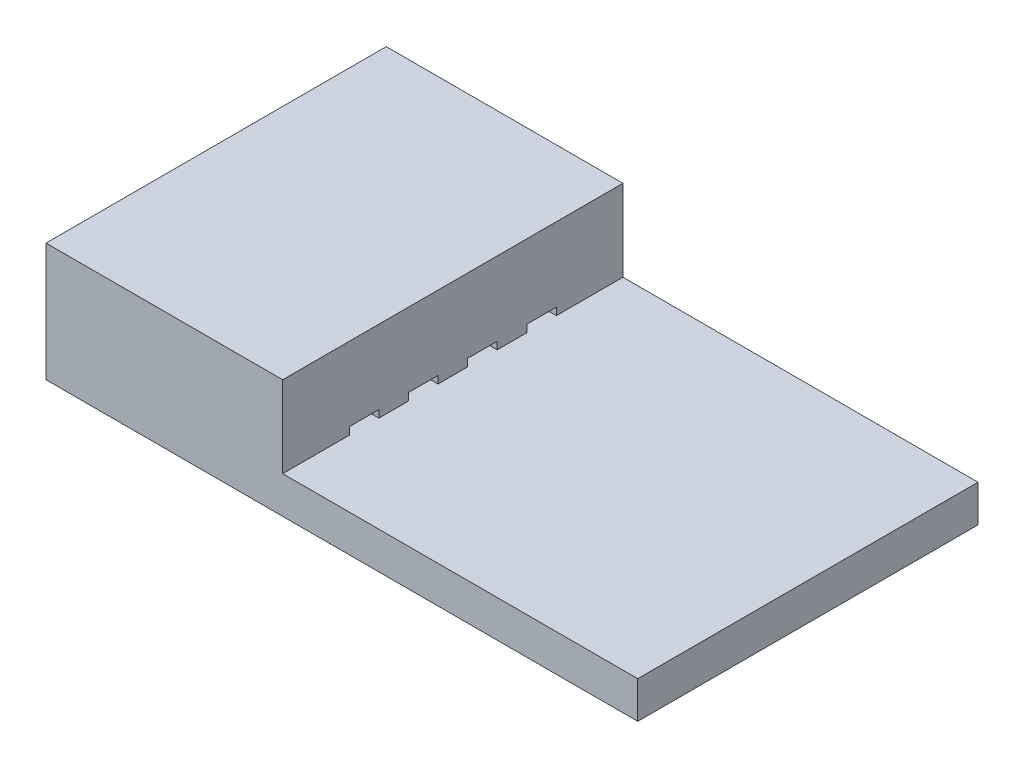
ISO-10303-21;
HEADER;
FILE_DESCRIPTION(('STEP AP214'),'2;1');
FILE_NAME('part.step','',(''),(''),'','','');
FILE_SCHEMA(('AUTOMOTIVE_DESIGN { 1 0 10303 214 1 1 1 1 }'));
ENDSEC;
DATA;
#1=APPLICATION_CONTEXT('core data for automotive mechanical design processes');
#2=APPLICATION_PROTOCOL_DEFINITION('international standard','automotive_design',2000,#1);
#3=PRODUCT_CONTEXT('',#1,'mechanical');
#4=PRODUCT('Part','Part','',(#3));
#5=PRODUCT_RELATED_PRODUCT_CATEGORY('part','',(#4));
#6=PRODUCT_DEFINITION_FORMATION('','',#4);
#7=PRODUCT_DEFINITION_CONTEXT('part definition',#1,'design');
#8=PRODUCT_DEFINITION('design','',#6,#7);
#9=PRODUCT_DEFINITION_SHAPE('','',#8);
#10=(LENGTH_UNIT() NAMED_UNIT(*) SI_UNIT(.MILLI.,.METRE.));
#11=(NAMED_UNIT(*) PLANE_ANGLE_UNIT() SI_UNIT($,.RADIAN.));
#12=(NAMED_UNIT(*) SI_UNIT($,.STERADIAN.) SOLID_ANGLE_UNIT());
#13=UNCERTAINTY_MEASURE_WITH_UNIT(LENGTH_MEASURE(1.E-05),#10,'distance_accuracy_value','');
#14=(GEOMETRIC_REPRESENTATION_CONTEXT(3) GLOBAL_UNCERTAINTY_ASSIGNED_CONTEXT((#13)) GLOBAL_UNIT_ASSIGNED_CONTEXT((#10,
#11,#12)) REPRESENTATION_CONTEXT('',''));
#15=CARTESIAN_POINT('',(0.,0.,0.));
#16=DIRECTION('',(0.,0.,1.));
#17=DIRECTION('',(1.,0.,0.));
#18=AXIS2_PLACEMENT_3D('',#15,#16,#17);
#19=CARTESIAN_POINT('',(-20.,2.,-5.75));
#20=DIRECTION('',(0.,0.,-1.));
#21=DIRECTION('',(-1.,0.,0.));
#22=AXIS2_PLACEMENT_3D('',#19,#20,#21);
#23=PLANE('',#22);
#24=DIRECTION('',(-1.,0.,0.));
#25=VECTOR('',#24,1.);
#26=CARTESIAN_POINT('',(0.,-0.750000000000001,-5.75));
#27=LINE('',#26,#25);
#28=CARTESIAN_POINT('',(0.,-0.750000000000001,-5.75));
#29=VERTEX_POINT('',#28);
#30=CARTESIAN_POINT('',(-12.,-0.750000000000001,-5.75));
#31=VERTEX_POINT('',#30);
#32=EDGE_CURVE('E316',#29,#31,#27,.T.);
#33=ORIENTED_EDGE('',*,*,#32,.F.);
#34=DIRECTION('',(0.,1.,0.));
#35=VECTOR('',#34,1.);
#36=CARTESIAN_POINT('',(0.,2.,-5.75));
#37=LINE('',#36,#35);
#38=CARTESIAN_POINT('',(0.,-2.,-5.75));
#39=VERTEX_POINT('',#38);
#40=EDGE_CURVE('E322',#39,#29,#37,.T.);
#41=ORIENTED_EDGE('',*,*,#40,.F.);
#42=DIRECTION('',(1.,0.,0.));
#43=VECTOR('',#42,1.);
#44=CARTESIAN_POINT('',(-20.,-2.,-5.75));
#45=LINE('',#44,#43);
#46=CARTESIAN_POINT('',(-20.,-2.,-5.75));
#47=VERTEX_POINT('',#46);
#48=EDGE_CURVE('E12',#47,#39,#45,.T.);
#49=ORIENTED_EDGE('',*,*,#48,.F.);
#50=DIRECTION('',(0.,1.,0.));
#51=VECTOR('',#50,1.);
#52=CARTESIAN_POINT('',(-20.,2.,-5.75));
#53=LINE('',#52,#51);
#54=CARTESIAN_POINT('',(-20.,2.,-5.75));
#55=VERTEX_POINT('',#54);
#56=EDGE_CURVE('E333',#47,#55,#53,.T.);
#57=ORIENTED_EDGE('',*,*,#56,.T.);
#58=DIRECTION('',(1.,0.,0.));
#59=VECTOR('',#58,1.);
#60=CARTESIAN_POINT('',(-20.,2.,-5.75));
#61=LINE('',#60,#59);
#62=CARTESIAN_POINT('',(-12.,2.,-5.75));
#63=VERTEX_POINT('',#62);
#64=EDGE_CURVE('E44',#55,#63,#61,.T.);
#65=ORIENTED_EDGE('',*,*,#64,.T.);
#66=DIRECTION('',(0.,1.,0.));
#67=VECTOR('',#66,1.);
#68=CARTESIAN_POINT('',(-12.,-18.6207701385947,-5.75));
#69=LINE('',#68,#67);
#70=EDGE_CURVE('E319',#31,#63,#69,.T.);
#71=ORIENTED_EDGE('',*,*,#70,.F.);
#72=EDGE_LOOP('',(#33,#41,#49,#57,#65,#71));
#73=FACE_BOUND('',#72,.T.);
#74=ADVANCED_FACE('F41',(#73),#23,.T.);
#75=CARTESIAN_POINT('',(-20.,-2.,5.75));
#76=DIRECTION('',(0.,-1.,0.));
#77=DIRECTION('',(0.,0.,-1.));
#78=AXIS2_PLACEMENT_3D('',#75,#76,#77);
#79=PLANE('',#78);
#80=DIRECTION('',(0.,0.,-1.));
#81=VECTOR('',#80,1.);
#82=CARTESIAN_POINT('',(0.,-2.,5.75));
#83=LINE('',#82,#81);
#84=CARTESIAN_POINT('',(0.,-2.,5.75));
#85=VERTEX_POINT('',#84);
#86=EDGE_CURVE('E337',#85,#39,#83,.T.);
#87=ORIENTED_EDGE('',*,*,#86,.F.);
#88=DIRECTION('',(1.,0.,0.));
#89=VECTOR('',#88,1.);
#90=CARTESIAN_POINT('',(-20.,-2.,5.75));
#91=LINE('',#90,#89);
#92=CARTESIAN_POINT('',(-20.,-2.,5.75));
#93=VERTEX_POINT('',#92);
#94=EDGE_CURVE('E49',#93,#85,#91,.T.);
#95=ORIENTED_EDGE('',*,*,#94,.F.);
#96=DIRECTION('',(0.,0.,-1.));
#97=VECTOR('',#96,1.);
#98=CARTESIAN_POINT('',(-20.,-2.,5.75));
#99=LINE('',#98,#97);
#100=EDGE_CURVE('E343',#93,#47,#99,.T.);
#101=ORIENTED_EDGE('',*,*,#100,.T.);
#102=ORIENTED_EDGE('',*,*,#48,.T.);
#103=EDGE_LOOP('',(#87,#95,#101,#102));
#104=FACE_BOUND('',#103,.T.);
#105=ADVANCED_FACE('F384',(#104),#79,.T.);
#106=CARTESIAN_POINT('',(-20.,2.,5.75));
#107=DIRECTION('',(0.,0.,1.));
#108=DIRECTION('',(1.,0.,0.));
#109=AXIS2_PLACEMENT_3D('',#106,#107,#108);
#110=PLANE('',#109);
#111=DIRECTION('',(1.,0.,0.));
#112=VECTOR('',#111,1.);
#113=CARTESIAN_POINT('',(0.,-0.750000000000001,5.75));
#114=LINE('',#113,#112);
#115=CARTESIAN_POINT('',(-12.,-0.750000000000001,5.75));
#116=VERTEX_POINT('',#115);
#117=CARTESIAN_POINT('',(0.,-0.750000000000001,5.75));
#118=VERTEX_POINT('',#117);
#119=EDGE_CURVE('E323',#116,#118,#114,.T.);
#120=ORIENTED_EDGE('',*,*,#119,.F.);
#121=DIRECTION('',(0.,1.,0.));
#122=VECTOR('',#121,1.);
#123=CARTESIAN_POINT('',(-12.,-18.6207701385947,5.75));
#124=LINE('',#123,#122);
#125=CARTESIAN_POINT('',(-12.,2.,5.75));
#126=VERTEX_POINT('',#125);
#127=EDGE_CURVE('E325',#116,#126,#124,.T.);
#128=ORIENTED_EDGE('',*,*,#127,.T.);
#129=DIRECTION('',(1.,0.,0.));
#130=VECTOR('',#129,1.);
#131=CARTESIAN_POINT('',(-20.,2.,5.75));
#132=LINE('',#131,#130);
#133=CARTESIAN_POINT('',(-20.,2.,5.75));
#134=VERTEX_POINT('',#133);
#135=EDGE_CURVE('E353',#134,#126,#132,.T.);
#136=ORIENTED_EDGE('',*,*,#135,.F.);
#137=DIRECTION('',(0.,-1.,0.));
#138=VECTOR('',#137,1.);
#139=CARTESIAN_POINT('',(-20.,2.,5.75));
#140=LINE('',#139,#138);
#141=EDGE_CURVE('E340',#134,#93,#140,.T.);
#142=ORIENTED_EDGE('',*,*,#141,.T.);
#143=ORIENTED_EDGE('',*,*,#94,.T.);
#144=DIRECTION('',(0.,-1.,0.));
#145=VECTOR('',#144,1.);
#146=CARTESIAN_POINT('',(0.,2.,5.75));
#147=LINE('',#146,#145);
#148=EDGE_CURVE('E348',#118,#85,#147,.T.);
#149=ORIENTED_EDGE('',*,*,#148,.F.);
#150=EDGE_LOOP('',(#120,#128,#136,#142,#143,#149));
#151=FACE_BOUND('',#150,.T.);
#152=ADVANCED_FACE('F369',(#151),#110,.T.);
#153=CARTESIAN_POINT('',(-20.,2.,5.75));
#154=DIRECTION('',(0.,1.,0.));
#155=DIRECTION('',(0.,0.,1.));
#156=AXIS2_PLACEMENT_3D('',#153,#154,#155);
#157=PLANE('',#156);
#158=DIRECTION('',(0.,0.,1.));
#159=VECTOR('',#158,1.);
#160=CARTESIAN_POINT('',(-12.,2.,5.75));
#161=LINE('',#160,#159);
#162=EDGE_CURVE('E307',#63,#126,#161,.T.);
#163=ORIENTED_EDGE('',*,*,#162,.F.);
#164=ORIENTED_EDGE('',*,*,#64,.F.);
#165=DIRECTION('',(0.,0.,1.));
#166=VECTOR('',#165,1.);
#167=CARTESIAN_POINT('',(-20.,2.,5.75));
#168=LINE('',#167,#166);
#169=EDGE_CURVE('E336',#55,#134,#168,.T.);
#170=ORIENTED_EDGE('',*,*,#169,.T.);
#171=ORIENTED_EDGE('',*,*,#135,.T.);
#172=EDGE_LOOP('',(#163,#164,#170,#171));
#173=FACE_BOUND('',#172,.T.);
#174=ADVANCED_FACE('F363',(#173),#157,.T.);
#175=CARTESIAN_POINT('',(-20.,-2.,-5.75));
#176=DIRECTION('',(1.,0.,0.));
#177=DIRECTION('',(0.,0.,-1.));
#178=AXIS2_PLACEMENT_3D('',#175,#176,#177);
#179=PLANE('',#178);
#180=DIRECTION('',(0.,0.,1.));
#181=VECTOR('',#180,1.);
#182=CARTESIAN_POINT('',(-20.,-0.500000000000001,-2.5));
#183=LINE('',#182,#181);
#184=CARTESIAN_POINT('',(-20.,-0.500000000000001,-3.5));
#185=VERTEX_POINT('',#184);
#186=CARTESIAN_POINT('',(-20.,-0.500000000000001,-2.5));
#187=VERTEX_POINT('',#186);
#188=EDGE_CURVE('E197',#185,#187,#183,.T.);
#189=ORIENTED_EDGE('',*,*,#188,.T.);
#190=DIRECTION('',(0.,-1.,0.));
#191=VECTOR('',#190,1.);
#192=CARTESIAN_POINT('',(-20.,-0.750000000000001,-2.5));
#193=LINE('',#192,#191);
#194=CARTESIAN_POINT('',(-20.,-0.750000000000001,-2.5));
#195=VERTEX_POINT('',#194);
#196=EDGE_CURVE('E192',#187,#195,#193,.T.);
#197=ORIENTED_EDGE('',*,*,#196,.T.);
#198=DIRECTION('',(0.,0.,-1.));
#199=VECTOR('',#198,1.);
#200=CARTESIAN_POINT('',(-20.,-0.750000000000001,-2.5));
#201=LINE('',#200,#199);
#202=CARTESIAN_POINT('',(-20.,-0.750000000000001,-3.5));
#203=VERTEX_POINT('',#202);
#204=EDGE_CURVE('E200',#195,#203,#201,.T.);
#205=ORIENTED_EDGE('',*,*,#204,.T.);
#206=DIRECTION('',(0.,1.,0.));
#207=VECTOR('',#206,1.);
#208=CARTESIAN_POINT('',(-20.,-0.750000000000001,-3.5));
#209=LINE('',#208,#207);
#210=EDGE_CURVE('E57',#203,#185,#209,.T.);
#211=ORIENTED_EDGE('',*,*,#210,.T.);
#212=EDGE_LOOP('',(#189,#197,#205,#211));
#213=FACE_BOUND('',#212,.T.);
#214=DIRECTION('',(0.,0.,1.));
#215=VECTOR('',#214,1.);
#216=CARTESIAN_POINT('',(-20.,-0.500000000000001,-0.5));
#217=LINE('',#216,#215);
#218=CARTESIAN_POINT('',(-20.,-0.500000000000001,-1.5));
#219=VERTEX_POINT('',#218);
#220=CARTESIAN_POINT('',(-20.,-0.500000000000001,-0.5));
#221=VERTEX_POINT('',#220);
#222=EDGE_CURVE('E235',#219,#221,#217,.T.);
#223=ORIENTED_EDGE('',*,*,#222,.T.);
#224=DIRECTION('',(0.,-1.,0.));
#225=VECTOR('',#224,1.);
#226=CARTESIAN_POINT('',(-20.,-0.750000000000001,-0.5));
#227=LINE('',#226,#225);
#228=CARTESIAN_POINT('',(-20.,-0.750000000000001,-0.5));
#229=VERTEX_POINT('',#228);
#230=EDGE_CURVE('E225',#221,#229,#227,.T.);
#231=ORIENTED_EDGE('',*,*,#230,.T.);
#232=DIRECTION('',(0.,0.,-1.));
#233=VECTOR('',#232,1.);
#234=CARTESIAN_POINT('',(-20.,-0.750000000000001,-0.5));
#235=LINE('',#234,#233);
#236=CARTESIAN_POINT('',(-20.,-0.750000000000001,-1.5));
#237=VERTEX_POINT('',#236);
#238=EDGE_CURVE('E228',#229,#237,#235,.T.);
#239=ORIENTED_EDGE('',*,*,#238,.T.);
#240=DIRECTION('',(0.,1.,0.));
#241=VECTOR('',#240,1.);
#242=CARTESIAN_POINT('',(-20.,-0.750000000000001,-1.5));
#243=LINE('',#242,#241);
#244=EDGE_CURVE('E232',#237,#219,#243,.T.);
#245=ORIENTED_EDGE('',*,*,#244,.T.);
#246=EDGE_LOOP('',(#223,#231,#239,#245));
#247=FACE_BOUND('',#246,.T.);
#248=DIRECTION('',(0.,0.,1.));
#249=VECTOR('',#248,1.);
#250=CARTESIAN_POINT('',(-20.,-0.5,1.5));
#251=LINE('',#250,#249);
#252=CARTESIAN_POINT('',(-20.,-0.5,0.5));
#253=VERTEX_POINT('',#252);
#254=CARTESIAN_POINT('',(-20.,-0.5,1.5));
#255=VERTEX_POINT('',#254);
#256=EDGE_CURVE('E265',#253,#255,#251,.T.);
#257=ORIENTED_EDGE('',*,*,#256,.T.);
#258=DIRECTION('',(0.,-1.,0.));
#259=VECTOR('',#258,1.);
#260=CARTESIAN_POINT('',(-20.,-0.75,1.5));
#261=LINE('',#260,#259);
#262=CARTESIAN_POINT('',(-20.,-0.75,1.5));
#263=VERTEX_POINT('',#262);
#264=EDGE_CURVE('E255',#255,#263,#261,.T.);
#265=ORIENTED_EDGE('',*,*,#264,.T.);
#266=DIRECTION('',(0.,0.,-1.));
#267=VECTOR('',#266,1.);
#268=CARTESIAN_POINT('',(-20.,-0.75,1.5));
#269=LINE('',#268,#267);
#270=CARTESIAN_POINT('',(-20.,-0.75,0.5));
#271=VERTEX_POINT('',#270);
#272=EDGE_CURVE('E258',#263,#271,#269,.T.);
#273=ORIENTED_EDGE('',*,*,#272,.T.);
#274=DIRECTION('',(0.,1.,0.));
#275=VECTOR('',#274,1.);
#276=CARTESIAN_POINT('',(-20.,-0.75,0.5));
#277=LINE('',#276,#275);
#278=EDGE_CURVE('E262',#271,#253,#277,.T.);
#279=ORIENTED_EDGE('',*,*,#278,.T.);
#280=EDGE_LOOP('',(#257,#265,#273,#279));
#281=FACE_BOUND('',#280,.T.);
#282=DIRECTION('',(0.,0.,1.));
#283=VECTOR('',#282,1.);
#284=CARTESIAN_POINT('',(-20.,-0.5,3.5));
#285=LINE('',#284,#283);
#286=CARTESIAN_POINT('',(-20.,-0.5,2.5));
#287=VERTEX_POINT('',#286);
#288=CARTESIAN_POINT('',(-20.,-0.5,3.5));
#289=VERTEX_POINT('',#288);
#290=EDGE_CURVE('E295',#287,#289,#285,.T.);
#291=ORIENTED_EDGE('',*,*,#290,.T.);
#292=DIRECTION('',(0.,-1.,0.));
#293=VECTOR('',#292,1.);
#294=CARTESIAN_POINT('',(-20.,-0.75,3.5));
#295=LINE('',#294,#293);
#296=CARTESIAN_POINT('',(-20.,-0.75,3.5));
#297=VERTEX_POINT('',#296);
#298=EDGE_CURVE('E285',#289,#297,#295,.T.);
#299=ORIENTED_EDGE('',*,*,#298,.T.);
#300=DIRECTION('',(0.,0.,-1.));
#301=VECTOR('',#300,1.);
#302=CARTESIAN_POINT('',(-20.,-0.75,3.5));
#303=LINE('',#302,#301);
#304=CARTESIAN_POINT('',(-20.,-0.75,2.5));
#305=VERTEX_POINT('',#304);
#306=EDGE_CURVE('E288',#297,#305,#303,.T.);
#307=ORIENTED_EDGE('',*,*,#306,.T.);
#308=DIRECTION('',(0.,1.,0.));
#309=VECTOR('',#308,1.);
#310=CARTESIAN_POINT('',(-20.,-0.75,2.5));
#311=LINE('',#310,#309);
#312=EDGE_CURVE('E292',#305,#287,#311,.T.);
#313=ORIENTED_EDGE('',*,*,#312,.T.);
#314=EDGE_LOOP('',(#291,#299,#307,#313));
#315=FACE_BOUND('',#314,.T.);
#316=ORIENTED_EDGE('',*,*,#56,.F.);
#317=ORIENTED_EDGE('',*,*,#100,.F.);
#318=ORIENTED_EDGE('',*,*,#141,.F.);
#319=ORIENTED_EDGE('',*,*,#169,.F.);
#320=EDGE_LOOP('',(#316,#317,#318,#319));
#321=FACE_BOUND('',#320,.T.);
#322=ADVANCED_FACE('F205',(#213,#247,#281,#315,#321),#179,.F.);
#323=CARTESIAN_POINT('',(0.,-2.,-5.75));
#324=DIRECTION('',(1.,0.,0.));
#325=DIRECTION('',(0.,0.,-1.));
#326=AXIS2_PLACEMENT_3D('',#323,#324,#325);
#327=PLANE('',#326);
#328=DIRECTION('',(0.,0.,-1.));
#329=VECTOR('',#328,1.);
#330=CARTESIAN_POINT('',(0.,-0.750000000000001,5.75));
#331=LINE('',#330,#329);
#332=EDGE_CURVE('E320',#118,#29,#331,.T.);
#333=ORIENTED_EDGE('',*,*,#332,.F.);
#334=ORIENTED_EDGE('',*,*,#148,.T.);
#335=ORIENTED_EDGE('',*,*,#86,.T.);
#336=ORIENTED_EDGE('',*,*,#40,.T.);
#337=EDGE_LOOP('',(#333,#334,#335,#336));
#338=FACE_BOUND('',#337,.T.);
#339=ADVANCED_FACE('F382',(#338),#327,.T.);
#340=CARTESIAN_POINT('',(-20.,-0.75,5.75));
#341=DIRECTION('',(0.,-1.,0.));
#342=DIRECTION('',(0.,0.,-1.));
#343=AXIS2_PLACEMENT_3D('',#340,#341,#342);
#344=PLANE('',#343);
#345=ORIENTED_EDGE('',*,*,#332,.T.);
#346=ORIENTED_EDGE('',*,*,#32,.T.);
#347=DIRECTION('',(0.,0.,1.));
#348=VECTOR('',#347,1.);
#349=CARTESIAN_POINT('',(-12.,-0.750000000000001,5.75));
#350=LINE('',#349,#348);
#351=CARTESIAN_POINT('',(-12.,-0.750000000000001,-3.5));
#352=VERTEX_POINT('',#351);
#353=EDGE_CURVE('E326',#31,#352,#350,.T.);
#354=ORIENTED_EDGE('',*,*,#353,.T.);
#355=DIRECTION('',(1.,0.,0.));
#356=VECTOR('',#355,1.);
#357=CARTESIAN_POINT('',(-20.,-0.750000000000001,-3.5));
#358=LINE('',#357,#356);
#359=EDGE_CURVE('E196',#203,#352,#358,.T.);
#360=ORIENTED_EDGE('',*,*,#359,.F.);
#361=ORIENTED_EDGE('',*,*,#204,.F.);
#362=DIRECTION('',(1.,0.,0.));
#363=VECTOR('',#362,1.);
#364=CARTESIAN_POINT('',(-20.,-0.750000000000001,-2.5));
#365=LINE('',#364,#363);
#366=CARTESIAN_POINT('',(-12.,-0.750000000000001,-2.5));
#367=VERTEX_POINT('',#366);
#368=EDGE_CURVE('E188',#195,#367,#365,.T.);
#369=ORIENTED_EDGE('',*,*,#368,.T.);
#370=CARTESIAN_POINT('',(-12.,-0.750000000000001,-1.5));
#371=VERTEX_POINT('',#370);
#372=EDGE_CURVE('E328',#367,#371,#350,.T.);
#373=ORIENTED_EDGE('',*,*,#372,.T.);
#374=DIRECTION('',(1.,0.,0.));
#375=VECTOR('',#374,1.);
#376=CARTESIAN_POINT('',(-20.,-0.750000000000001,-1.5));
#377=LINE('',#376,#375);
#378=EDGE_CURVE('E250',#237,#371,#377,.T.);
#379=ORIENTED_EDGE('',*,*,#378,.F.);
#380=ORIENTED_EDGE('',*,*,#238,.F.);
#381=DIRECTION('',(1.,0.,0.));
#382=VECTOR('',#381,1.);
#383=CARTESIAN_POINT('',(-20.,-0.750000000000001,-0.5));
#384=LINE('',#383,#382);
#385=CARTESIAN_POINT('',(-12.,-0.750000000000001,-0.5));
#386=VERTEX_POINT('',#385);
#387=EDGE_CURVE('E238',#229,#386,#384,.T.);
#388=ORIENTED_EDGE('',*,*,#387,.T.);
#389=CARTESIAN_POINT('',(-12.,-0.75,0.5));
#390=VERTEX_POINT('',#389);
#391=EDGE_CURVE('E455',#386,#390,#350,.T.);
#392=ORIENTED_EDGE('',*,*,#391,.T.);
#393=DIRECTION('',(1.,0.,0.));
#394=VECTOR('',#393,1.);
#395=CARTESIAN_POINT('',(-20.,-0.75,0.5));
#396=LINE('',#395,#394);
#397=EDGE_CURVE('E280',#271,#390,#396,.T.);
#398=ORIENTED_EDGE('',*,*,#397,.F.);
#399=ORIENTED_EDGE('',*,*,#272,.F.);
#400=DIRECTION('',(1.,0.,0.));
#401=VECTOR('',#400,1.);
#402=CARTESIAN_POINT('',(-20.,-0.75,1.5));
#403=LINE('',#402,#401);
#404=CARTESIAN_POINT('',(-12.,-0.750000000000001,1.5));
#405=VERTEX_POINT('',#404);
#406=EDGE_CURVE('E268',#263,#405,#403,.T.);
#407=ORIENTED_EDGE('',*,*,#406,.T.);
#408=CARTESIAN_POINT('',(-12.,-0.75,2.5));
#409=VERTEX_POINT('',#408);
#410=EDGE_CURVE('E456',#405,#409,#350,.T.);
#411=ORIENTED_EDGE('',*,*,#410,.T.);
#412=DIRECTION('',(1.,0.,0.));
#413=VECTOR('',#412,1.);
#414=CARTESIAN_POINT('',(-20.,-0.75,2.5));
#415=LINE('',#414,#413);
#416=EDGE_CURVE('E310',#305,#409,#415,.T.);
#417=ORIENTED_EDGE('',*,*,#416,.F.);
#418=ORIENTED_EDGE('',*,*,#306,.F.);
#419=DIRECTION('',(1.,0.,0.));
#420=VECTOR('',#419,1.);
#421=CARTESIAN_POINT('',(-20.,-0.75,3.5));
#422=LINE('',#421,#420);
#423=CARTESIAN_POINT('',(-12.,-0.750000000000001,3.5));
#424=VERTEX_POINT('',#423);
#425=EDGE_CURVE('E298',#297,#424,#422,.T.);
#426=ORIENTED_EDGE('',*,*,#425,.T.);
#427=EDGE_CURVE('E329',#424,#116,#350,.T.);
#428=ORIENTED_EDGE('',*,*,#427,.T.);
#429=ORIENTED_EDGE('',*,*,#119,.T.);
#430=EDGE_LOOP('',(#345,#346,#354,#360,#361,#369,#373,#379,#380,#388,#392,#398,#399,#407,#411,
#417,#418,#426,#428,#429));
#431=FACE_BOUND('',#430,.T.);
#432=ADVANCED_FACE('F201',(#431),#344,.F.);
#433=CARTESIAN_POINT('',(-12.,-18.6207701385947,5.75));
#434=DIRECTION('',(-1.,0.,0.));
#435=DIRECTION('',(0.,0.,1.));
#436=AXIS2_PLACEMENT_3D('',#433,#434,#435);
#437=PLANE('',#436);
#438=ORIENTED_EDGE('',*,*,#372,.F.);
#439=DIRECTION('',(0.,-1.,0.));
#440=VECTOR('',#439,1.);
#441=CARTESIAN_POINT('',(-12.,-0.750000000000001,-2.5));
#442=LINE('',#441,#440);
#443=CARTESIAN_POINT('',(-12.,-0.500000000000001,-2.5));
#444=VERTEX_POINT('',#443);
#445=EDGE_CURVE('E65',#444,#367,#442,.T.);
#446=ORIENTED_EDGE('',*,*,#445,.F.);
#447=DIRECTION('',(0.,0.,1.));
#448=VECTOR('',#447,1.);
#449=CARTESIAN_POINT('',(-12.,-0.500000000000001,-2.5));
#450=LINE('',#449,#448);
#451=CARTESIAN_POINT('',(-12.,-0.500000000000001,-3.5));
#452=VERTEX_POINT('',#451);
#453=EDGE_CURVE('E208',#452,#444,#450,.T.);
#454=ORIENTED_EDGE('',*,*,#453,.F.);
#455=DIRECTION('',(0.,1.,0.));
#456=VECTOR('',#455,1.);
#457=CARTESIAN_POINT('',(-12.,-0.750000000000001,-3.5));
#458=LINE('',#457,#456);
#459=EDGE_CURVE('E211',#352,#452,#458,.T.);
#460=ORIENTED_EDGE('',*,*,#459,.F.);
#461=ORIENTED_EDGE('',*,*,#353,.F.);
#462=ORIENTED_EDGE('',*,*,#70,.T.);
#463=ORIENTED_EDGE('',*,*,#162,.T.);
#464=ORIENTED_EDGE('',*,*,#127,.F.);
#465=ORIENTED_EDGE('',*,*,#427,.F.);
#466=DIRECTION('',(0.,-1.,0.));
#467=VECTOR('',#466,1.);
#468=CARTESIAN_POINT('',(-12.,-0.75,3.5));
#469=LINE('',#468,#467);
#470=CARTESIAN_POINT('',(-12.,-0.5,3.5));
#471=VERTEX_POINT('',#470);
#472=EDGE_CURVE('E277',#471,#424,#469,.T.);
#473=ORIENTED_EDGE('',*,*,#472,.F.);
#474=DIRECTION('',(0.,0.,1.));
#475=VECTOR('',#474,1.);
#476=CARTESIAN_POINT('',(-12.,-0.5,3.5));
#477=LINE('',#476,#475);
#478=CARTESIAN_POINT('',(-12.,-0.5,2.5));
#479=VERTEX_POINT('',#478);
#480=EDGE_CURVE('E289',#479,#471,#477,.T.);
#481=ORIENTED_EDGE('',*,*,#480,.F.);
#482=DIRECTION('',(0.,1.,0.));
#483=VECTOR('',#482,1.);
#484=CARTESIAN_POINT('',(-12.,-0.75,2.5));
#485=LINE('',#484,#483);
#486=EDGE_CURVE('E300',#409,#479,#485,.T.);
#487=ORIENTED_EDGE('',*,*,#486,.F.);
#488=ORIENTED_EDGE('',*,*,#410,.F.);
#489=DIRECTION('',(0.,-1.,0.));
#490=VECTOR('',#489,1.);
#491=CARTESIAN_POINT('',(-12.,-0.75,1.5));
#492=LINE('',#491,#490);
#493=CARTESIAN_POINT('',(-12.,-0.5,1.5));
#494=VERTEX_POINT('',#493);
#495=EDGE_CURVE('E247',#494,#405,#492,.T.);
#496=ORIENTED_EDGE('',*,*,#495,.F.);
#497=DIRECTION('',(0.,0.,1.));
#498=VECTOR('',#497,1.);
#499=CARTESIAN_POINT('',(-12.,-0.5,1.5));
#500=LINE('',#499,#498);
#501=CARTESIAN_POINT('',(-12.,-0.5,0.5));
#502=VERTEX_POINT('',#501);
#503=EDGE_CURVE('E259',#502,#494,#500,.T.);
#504=ORIENTED_EDGE('',*,*,#503,.F.);
#505=DIRECTION('',(0.,1.,0.));
#506=VECTOR('',#505,1.);
#507=CARTESIAN_POINT('',(-12.,-0.75,0.5));
#508=LINE('',#507,#506);
#509=EDGE_CURVE('E270',#390,#502,#508,.T.);
#510=ORIENTED_EDGE('',*,*,#509,.F.);
#511=ORIENTED_EDGE('',*,*,#391,.F.);
#512=DIRECTION('',(0.,-1.,0.));
#513=VECTOR('',#512,1.);
#514=CARTESIAN_POINT('',(-12.,-0.750000000000001,-0.5));
#515=LINE('',#514,#513);
#516=CARTESIAN_POINT('',(-12.,-0.500000000000001,-0.5));
#517=VERTEX_POINT('',#516);
#518=EDGE_CURVE('E221',#517,#386,#515,.T.);
#519=ORIENTED_EDGE('',*,*,#518,.F.);
#520=DIRECTION('',(0.,0.,1.));
#521=VECTOR('',#520,1.);
#522=CARTESIAN_POINT('',(-12.,-0.500000000000001,-0.5));
#523=LINE('',#522,#521);
#524=CARTESIAN_POINT('',(-12.,-0.500000000000001,-1.5));
#525=VERTEX_POINT('',#524);
#526=EDGE_CURVE('E229',#525,#517,#523,.T.);
#527=ORIENTED_EDGE('',*,*,#526,.F.);
#528=DIRECTION('',(0.,1.,0.));
#529=VECTOR('',#528,1.);
#530=CARTESIAN_POINT('',(-12.,-0.750000000000001,-1.5));
#531=LINE('',#530,#529);
#532=EDGE_CURVE('E240',#371,#525,#531,.T.);
#533=ORIENTED_EDGE('',*,*,#532,.F.);
#534=EDGE_LOOP('',(#438,#446,#454,#460,#461,#462,#463,#464,#465,#473,#481,#487,#488,#496,#504,
#510,#511,#519,#527,#533));
#535=FACE_BOUND('',#534,.T.);
#536=ADVANCED_FACE('F375',(#535),#437,.F.);
#537=CARTESIAN_POINT('',(-20.,-0.75,3.5));
#538=DIRECTION('',(0.,0.,1.));
#539=DIRECTION('',(0.,-1.,0.));
#540=AXIS2_PLACEMENT_3D('',#537,#538,#539);
#541=PLANE('',#540);
#542=ORIENTED_EDGE('',*,*,#472,.T.);
#543=ORIENTED_EDGE('',*,*,#425,.F.);
#544=ORIENTED_EDGE('',*,*,#298,.F.);
#545=DIRECTION('',(1.,0.,0.));
#546=VECTOR('',#545,1.);
#547=CARTESIAN_POINT('',(-20.,-0.5,3.5));
#548=LINE('',#547,#546);
#549=EDGE_CURVE('E305',#289,#471,#548,.T.);
#550=ORIENTED_EDGE('',*,*,#549,.T.);
#551=EDGE_LOOP('',(#542,#543,#544,#550));
#552=FACE_BOUND('',#551,.T.);
#553=ADVANCED_FACE('F406',(#552),#541,.F.);
#554=CARTESIAN_POINT('',(-20.,-0.5,3.5));
#555=DIRECTION('',(0.,1.,0.));
#556=DIRECTION('',(0.,0.,1.));
#557=AXIS2_PLACEMENT_3D('',#554,#555,#556);
#558=PLANE('',#557);
#559=ORIENTED_EDGE('',*,*,#480,.T.);
#560=ORIENTED_EDGE('',*,*,#549,.F.);
#561=ORIENTED_EDGE('',*,*,#290,.F.);
#562=DIRECTION('',(1.,0.,0.));
#563=VECTOR('',#562,1.);
#564=CARTESIAN_POINT('',(-20.,-0.5,2.5));
#565=LINE('',#564,#563);
#566=EDGE_CURVE('E308',#287,#479,#565,.T.);
#567=ORIENTED_EDGE('',*,*,#566,.T.);
#568=EDGE_LOOP('',(#559,#560,#561,#567));
#569=FACE_BOUND('',#568,.T.);
#570=ADVANCED_FACE('F409',(#569),#558,.F.);
#571=CARTESIAN_POINT('',(-20.,-0.75,2.5));
#572=DIRECTION('',(0.,0.,-1.));
#573=DIRECTION('',(0.,1.,0.));
#574=AXIS2_PLACEMENT_3D('',#571,#572,#573);
#575=PLANE('',#574);
#576=ORIENTED_EDGE('',*,*,#486,.T.);
#577=ORIENTED_EDGE('',*,*,#566,.F.);
#578=ORIENTED_EDGE('',*,*,#312,.F.);
#579=ORIENTED_EDGE('',*,*,#416,.T.);
#580=EDGE_LOOP('',(#576,#577,#578,#579));
#581=FACE_BOUND('',#580,.T.);
#582=ADVANCED_FACE('F411',(#581),#575,.F.);
#583=CARTESIAN_POINT('',(-20.,-0.75,1.5));
#584=DIRECTION('',(0.,0.,1.));
#585=DIRECTION('',(0.,-1.,0.));
#586=AXIS2_PLACEMENT_3D('',#583,#584,#585);
#587=PLANE('',#586);
#588=ORIENTED_EDGE('',*,*,#495,.T.);
#589=ORIENTED_EDGE('',*,*,#406,.F.);
#590=ORIENTED_EDGE('',*,*,#264,.F.);
#591=DIRECTION('',(1.,0.,0.));
#592=VECTOR('',#591,1.);
#593=CARTESIAN_POINT('',(-20.,-0.5,1.5));
#594=LINE('',#593,#592);
#595=EDGE_CURVE('E275',#255,#494,#594,.T.);
#596=ORIENTED_EDGE('',*,*,#595,.T.);
#597=EDGE_LOOP('',(#588,#589,#590,#596));
#598=FACE_BOUND('',#597,.T.);
#599=ADVANCED_FACE('F414',(#598),#587,.F.);
#600=CARTESIAN_POINT('',(-20.,-0.5,1.5));
#601=DIRECTION('',(0.,1.,0.));
#602=DIRECTION('',(0.,0.,1.));
#603=AXIS2_PLACEMENT_3D('',#600,#601,#602);
#604=PLANE('',#603);
#605=ORIENTED_EDGE('',*,*,#503,.T.);
#606=ORIENTED_EDGE('',*,*,#595,.F.);
#607=ORIENTED_EDGE('',*,*,#256,.F.);
#608=DIRECTION('',(1.,0.,0.));
#609=VECTOR('',#608,1.);
#610=CARTESIAN_POINT('',(-20.,-0.5,0.5));
#611=LINE('',#610,#609);
#612=EDGE_CURVE('E278',#253,#502,#611,.T.);
#613=ORIENTED_EDGE('',*,*,#612,.T.);
#614=EDGE_LOOP('',(#605,#606,#607,#613));
#615=FACE_BOUND('',#614,.T.);
#616=ADVANCED_FACE('F421',(#615),#604,.F.);
#617=CARTESIAN_POINT('',(-20.,-0.75,0.5));
#618=DIRECTION('',(0.,0.,-1.));
#619=DIRECTION('',(0.,1.,0.));
#620=AXIS2_PLACEMENT_3D('',#617,#618,#619);
#621=PLANE('',#620);
#622=ORIENTED_EDGE('',*,*,#509,.T.);
#623=ORIENTED_EDGE('',*,*,#612,.F.);
#624=ORIENTED_EDGE('',*,*,#278,.F.);
#625=ORIENTED_EDGE('',*,*,#397,.T.);
#626=EDGE_LOOP('',(#622,#623,#624,#625));
#627=FACE_BOUND('',#626,.T.);
#628=ADVANCED_FACE('F423',(#627),#621,.F.);
#629=CARTESIAN_POINT('',(-20.,-0.750000000000001,-0.5));
#630=DIRECTION('',(0.,0.,1.));
#631=DIRECTION('',(0.,-1.,0.));
#632=AXIS2_PLACEMENT_3D('',#629,#630,#631);
#633=PLANE('',#632);
#634=ORIENTED_EDGE('',*,*,#518,.T.);
#635=ORIENTED_EDGE('',*,*,#387,.F.);
#636=ORIENTED_EDGE('',*,*,#230,.F.);
#637=DIRECTION('',(1.,0.,0.));
#638=VECTOR('',#637,1.);
#639=CARTESIAN_POINT('',(-20.,-0.500000000000001,-0.5));
#640=LINE('',#639,#638);
#641=EDGE_CURVE('E245',#221,#517,#640,.T.);
#642=ORIENTED_EDGE('',*,*,#641,.T.);
#643=EDGE_LOOP('',(#634,#635,#636,#642));
#644=FACE_BOUND('',#643,.T.);
#645=ADVANCED_FACE('F426',(#644),#633,.F.);
#646=CARTESIAN_POINT('',(-20.,-0.500000000000001,-0.5));
#647=DIRECTION('',(0.,1.,0.));
#648=DIRECTION('',(0.,0.,1.));
#649=AXIS2_PLACEMENT_3D('',#646,#647,#648);
#650=PLANE('',#649);
#651=ORIENTED_EDGE('',*,*,#526,.T.);
#652=ORIENTED_EDGE('',*,*,#641,.F.);
#653=ORIENTED_EDGE('',*,*,#222,.F.);
#654=DIRECTION('',(1.,0.,0.));
#655=VECTOR('',#654,1.);
#656=CARTESIAN_POINT('',(-20.,-0.500000000000001,-1.5));
#657=LINE('',#656,#655);
#658=EDGE_CURVE('E248',#219,#525,#657,.T.);
#659=ORIENTED_EDGE('',*,*,#658,.T.);
#660=EDGE_LOOP('',(#651,#652,#653,#659));
#661=FACE_BOUND('',#660,.T.);
#662=ADVANCED_FACE('F433',(#661),#650,.F.);
#663=CARTESIAN_POINT('',(-20.,-0.750000000000001,-1.5));
#664=DIRECTION('',(0.,0.,-1.));
#665=DIRECTION('',(0.,1.,0.));
#666=AXIS2_PLACEMENT_3D('',#663,#664,#665);
#667=PLANE('',#666);
#668=ORIENTED_EDGE('',*,*,#532,.T.);
#669=ORIENTED_EDGE('',*,*,#658,.F.);
#670=ORIENTED_EDGE('',*,*,#244,.F.);
#671=ORIENTED_EDGE('',*,*,#378,.T.);
#672=EDGE_LOOP('',(#668,#669,#670,#671));
#673=FACE_BOUND('',#672,.T.);
#674=ADVANCED_FACE('F435',(#673),#667,.F.);
#675=CARTESIAN_POINT('',(-20.,-0.750000000000001,-2.5));
#676=DIRECTION('',(0.,0.,1.));
#677=DIRECTION('',(0.,-1.,0.));
#678=AXIS2_PLACEMENT_3D('',#675,#676,#677);
#679=PLANE('',#678);
#680=ORIENTED_EDGE('',*,*,#445,.T.);
#681=ORIENTED_EDGE('',*,*,#368,.F.);
#682=ORIENTED_EDGE('',*,*,#196,.F.);
#683=DIRECTION('',(1.,0.,0.));
#684=VECTOR('',#683,1.);
#685=CARTESIAN_POINT('',(-20.,-0.500000000000001,-2.5));
#686=LINE('',#685,#684);
#687=EDGE_CURVE('E219',#187,#444,#686,.T.);
#688=ORIENTED_EDGE('',*,*,#687,.T.);
#689=EDGE_LOOP('',(#680,#681,#682,#688));
#690=FACE_BOUND('',#689,.T.);
#691=ADVANCED_FACE('F190',(#690),#679,.F.);
#692=CARTESIAN_POINT('',(-20.,-0.500000000000001,-2.5));
#693=DIRECTION('',(0.,1.,0.));
#694=DIRECTION('',(0.,0.,1.));
#695=AXIS2_PLACEMENT_3D('',#692,#693,#694);
#696=PLANE('',#695);
#697=ORIENTED_EDGE('',*,*,#453,.T.);
#698=ORIENTED_EDGE('',*,*,#687,.F.);
#699=ORIENTED_EDGE('',*,*,#188,.F.);
#700=DIRECTION('',(1.,0.,0.));
#701=VECTOR('',#700,1.);
#702=CARTESIAN_POINT('',(-20.,-0.500000000000001,-3.5));
#703=LINE('',#702,#701);
#704=EDGE_CURVE('E222',#185,#452,#703,.T.);
#705=ORIENTED_EDGE('',*,*,#704,.T.);
#706=EDGE_LOOP('',(#697,#698,#699,#705));
#707=FACE_BOUND('',#706,.T.);
#708=ADVANCED_FACE('F444',(#707),#696,.F.);
#709=CARTESIAN_POINT('',(-20.,-0.750000000000001,-3.5));
#710=DIRECTION('',(0.,0.,-1.));
#711=DIRECTION('',(0.,1.,0.));
#712=AXIS2_PLACEMENT_3D('',#709,#710,#711);
#713=PLANE('',#712);
#714=ORIENTED_EDGE('',*,*,#459,.T.);
#715=ORIENTED_EDGE('',*,*,#704,.F.);
#716=ORIENTED_EDGE('',*,*,#210,.F.);
#717=ORIENTED_EDGE('',*,*,#359,.T.);
#718=EDGE_LOOP('',(#714,#715,#716,#717));
#719=FACE_BOUND('',#718,.T.);
#720=ADVANCED_FACE('F445',(#719),#713,.F.);
#721=CLOSED_SHELL('',(#74,#105,#152,#174,#322,#339,#432,#536,#553,#570,#582,#599,#616,#628,#645,
#662,#674,#691,#708,#720));
#722=MANIFOLD_SOLID_BREP('B2',#721);
#723=ADVANCED_BREP_SHAPE_REPRESENTATION('',(#18,#722),#14);
#724=SHAPE_DEFINITION_REPRESENTATION(#9,#723);
ENDSEC;
END-ISO-10303-21;
